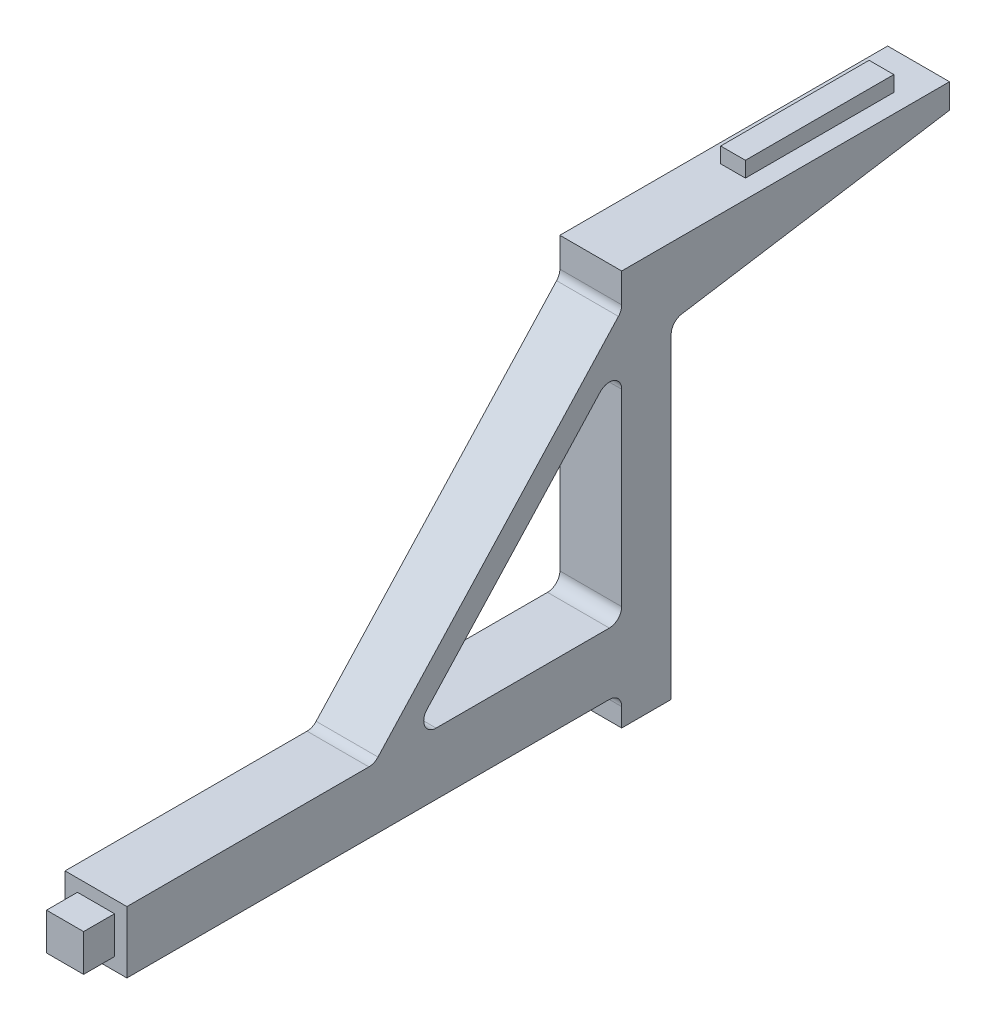
ISO-10303-21;
HEADER;
FILE_DESCRIPTION(('STEP AP214'),'2;1');
FILE_NAME('part.step','',(''),(''),'','','');
FILE_SCHEMA(('AUTOMOTIVE_DESIGN { 1 0 10303 214 1 1 1 1 }'));
ENDSEC;
DATA;
#1=APPLICATION_CONTEXT('core data for automotive mechanical design processes');
#2=APPLICATION_PROTOCOL_DEFINITION('international standard','automotive_design',2000,#1);
#3=PRODUCT_CONTEXT('',#1,'mechanical');
#4=PRODUCT('Part','Part','',(#3));
#5=PRODUCT_RELATED_PRODUCT_CATEGORY('part','',(#4));
#6=PRODUCT_DEFINITION_FORMATION('','',#4);
#7=PRODUCT_DEFINITION_CONTEXT('part definition',#1,'design');
#8=PRODUCT_DEFINITION('design','',#6,#7);
#9=PRODUCT_DEFINITION_SHAPE('','',#8);
#10=(LENGTH_UNIT() NAMED_UNIT(*) SI_UNIT(.MILLI.,.METRE.));
#11=(NAMED_UNIT(*) PLANE_ANGLE_UNIT() SI_UNIT($,.RADIAN.));
#12=(NAMED_UNIT(*) SI_UNIT($,.STERADIAN.) SOLID_ANGLE_UNIT());
#13=UNCERTAINTY_MEASURE_WITH_UNIT(LENGTH_MEASURE(1.E-05),#10,'distance_accuracy_value','');
#14=(GEOMETRIC_REPRESENTATION_CONTEXT(3) GLOBAL_UNCERTAINTY_ASSIGNED_CONTEXT((#13)) GLOBAL_UNIT_ASSIGNED_CONTEXT((#10,
#11,#12)) REPRESENTATION_CONTEXT('',''));
#15=CARTESIAN_POINT('',(0.,0.,0.));
#16=DIRECTION('',(0.,0.,1.));
#17=DIRECTION('',(1.,0.,0.));
#18=AXIS2_PLACEMENT_3D('',#15,#16,#17);
#19=CARTESIAN_POINT('',(-6.35,93.98,10.16));
#20=DIRECTION('',(0.,1.,0.));
#21=DIRECTION('',(0.,0.,1.));
#22=AXIS2_PLACEMENT_3D('',#19,#20,#21);
#23=PLANE('',#22);
#24=DIRECTION('',(0.,0.,-1.));
#25=VECTOR('',#24,1.);
#26=CARTESIAN_POINT('',(6.35,93.98,10.16));
#27=LINE('',#26,#25);
#28=CARTESIAN_POINT('',(6.35,93.98,10.16));
#29=VERTEX_POINT('',#28);
#30=CARTESIAN_POINT('',(6.35,93.98,-57.15));
#31=VERTEX_POINT('',#30);
#32=EDGE_CURVE('E604',#29,#31,#27,.T.);
#33=ORIENTED_EDGE('',*,*,#32,.T.);
#34=DIRECTION('',(-1.,0.,0.));
#35=VECTOR('',#34,1.);
#36=CARTESIAN_POINT('',(63.7253335502287,93.98,-57.15));
#37=LINE('',#36,#35);
#38=CARTESIAN_POINT('',(-6.35,93.98,-57.15));
#39=VERTEX_POINT('',#38);
#40=EDGE_CURVE('E479',#31,#39,#37,.T.);
#41=ORIENTED_EDGE('',*,*,#40,.T.);
#42=DIRECTION('',(0.,0.,-1.));
#43=VECTOR('',#42,1.);
#44=CARTESIAN_POINT('',(-6.35,93.98,10.16));
#45=LINE('',#44,#43);
#46=CARTESIAN_POINT('',(-6.35,93.98,10.16));
#47=VERTEX_POINT('',#46);
#48=EDGE_CURVE('E594',#47,#39,#45,.T.);
#49=ORIENTED_EDGE('',*,*,#48,.F.);
#50=DIRECTION('',(1.,0.,0.));
#51=VECTOR('',#50,1.);
#52=CARTESIAN_POINT('',(-6.35,93.98,10.16));
#53=LINE('',#52,#51);
#54=EDGE_CURVE('E589',#47,#29,#53,.T.);
#55=ORIENTED_EDGE('',*,*,#54,.T.);
#56=EDGE_LOOP('',(#33,#41,#49,#55));
#57=FACE_BOUND('',#56,.T.);
#58=DIRECTION('',(-1.,0.,0.));
#59=VECTOR('',#58,1.);
#60=CARTESIAN_POINT('',(-2.54,93.98,-49.53));
#61=LINE('',#60,#59);
#62=CARTESIAN_POINT('',(2.54,93.98,-49.53));
#63=VERTEX_POINT('',#62);
#64=CARTESIAN_POINT('',(-2.54,93.98,-49.53));
#65=VERTEX_POINT('',#64);
#66=EDGE_CURVE('E432',#63,#65,#61,.T.);
#67=ORIENTED_EDGE('',*,*,#66,.F.);
#68=DIRECTION('',(0.,0.,-1.));
#69=VECTOR('',#68,1.);
#70=CARTESIAN_POINT('',(2.54,93.98,-19.05));
#71=LINE('',#70,#69);
#72=CARTESIAN_POINT('',(2.54,93.98,-19.05));
#73=VERTEX_POINT('',#72);
#74=EDGE_CURVE('E408',#73,#63,#71,.T.);
#75=ORIENTED_EDGE('',*,*,#74,.F.);
#76=DIRECTION('',(1.,0.,0.));
#77=VECTOR('',#76,1.);
#78=CARTESIAN_POINT('',(-2.54,93.98,-19.05));
#79=LINE('',#78,#77);
#80=CARTESIAN_POINT('',(-2.54,93.98,-19.05));
#81=VERTEX_POINT('',#80);
#82=EDGE_CURVE('E419',#81,#73,#79,.T.);
#83=ORIENTED_EDGE('',*,*,#82,.F.);
#84=DIRECTION('',(0.,0.,1.));
#85=VECTOR('',#84,1.);
#86=CARTESIAN_POINT('',(-2.54,93.98,-19.05));
#87=LINE('',#86,#85);
#88=EDGE_CURVE('E435',#65,#81,#87,.T.);
#89=ORIENTED_EDGE('',*,*,#88,.F.);
#90=EDGE_LOOP('',(#67,#75,#83,#89));
#91=FACE_BOUND('',#90,.T.);
#92=ADVANCED_FACE('F147',(#57,#91),#23,.T.);
#93=CARTESIAN_POINT('',(0.,0.,0.));
#94=DIRECTION('',(0.,0.,1.));
#95=DIRECTION('',(1.,0.,0.));
#96=AXIS2_PLACEMENT_3D('',#93,#94,#95);
#97=PLANE('',#96);
#98=DIRECTION('',(0.,1.,0.));
#99=VECTOR('',#98,1.);
#100=CARTESIAN_POINT('',(-6.35,12.7,0.));
#101=LINE('',#100,#99);
#102=CARTESIAN_POINT('',(-6.35,12.7,0.));
#103=VERTEX_POINT('',#102);
#104=CARTESIAN_POINT('',(-6.35,77.6468841022824,0.));
#105=VERTEX_POINT('',#104);
#106=EDGE_CURVE('E598',#103,#105,#101,.T.);
#107=ORIENTED_EDGE('',*,*,#106,.T.);
#108=DIRECTION('',(1.,0.,0.));
#109=VECTOR('',#108,1.);
#110=CARTESIAN_POINT('',(0.,77.6468841022824,0.));
#111=LINE('',#110,#109);
#112=CARTESIAN_POINT('',(6.35,77.6468841022824,0.));
#113=VERTEX_POINT('',#112);
#114=EDGE_CURVE('E623',#105,#113,#111,.T.);
#115=ORIENTED_EDGE('',*,*,#114,.T.);
#116=DIRECTION('',(0.,1.,0.));
#117=VECTOR('',#116,1.);
#118=CARTESIAN_POINT('',(6.35,43.18,0.));
#119=LINE('',#118,#117);
#120=CARTESIAN_POINT('',(6.35,12.7,0.));
#121=VERTEX_POINT('',#120);
#122=EDGE_CURVE('E577',#121,#113,#119,.T.);
#123=ORIENTED_EDGE('',*,*,#122,.F.);
#124=DIRECTION('',(1.,0.,0.));
#125=VECTOR('',#124,1.);
#126=CARTESIAN_POINT('',(12.7,12.7,0.));
#127=LINE('',#126,#125);
#128=EDGE_CURVE('E458',#103,#121,#127,.T.);
#129=ORIENTED_EDGE('',*,*,#128,.F.);
#130=EDGE_LOOP('',(#107,#115,#123,#129));
#131=FACE_BOUND('',#130,.T.);
#132=ADVANCED_FACE('F800',(#131),#97,.F.);
#133=CARTESIAN_POINT('',(0.,0.,10.16));
#134=DIRECTION('',(0.,0.,1.));
#135=DIRECTION('',(1.,0.,0.));
#136=AXIS2_PLACEMENT_3D('',#133,#134,#135);
#137=PLANE('',#136);
#138=DIRECTION('',(0.,-1.,0.));
#139=VECTOR('',#138,1.);
#140=CARTESIAN_POINT('',(-6.35,12.7,10.16));
#141=LINE('',#140,#139);
#142=CARTESIAN_POINT('',(-6.35,87.9580548598883,10.16));
#143=VERTEX_POINT('',#142);
#144=EDGE_CURVE('E578',#47,#143,#141,.T.);
#145=ORIENTED_EDGE('',*,*,#144,.T.);
#146=DIRECTION('',(1.,0.,0.));
#147=VECTOR('',#146,1.);
#148=CARTESIAN_POINT('',(0.,87.9580548598883,10.16));
#149=LINE('',#148,#147);
#150=CARTESIAN_POINT('',(6.35,87.9580548598883,10.16));
#151=VERTEX_POINT('',#150);
#152=EDGE_CURVE('E630',#143,#151,#149,.T.);
#153=ORIENTED_EDGE('',*,*,#152,.T.);
#154=DIRECTION('',(0.,-1.,0.));
#155=VECTOR('',#154,1.);
#156=CARTESIAN_POINT('',(6.35,43.18,10.16));
#157=LINE('',#156,#155);
#158=EDGE_CURVE('E585',#29,#151,#157,.T.);
#159=ORIENTED_EDGE('',*,*,#158,.F.);
#160=ORIENTED_EDGE('',*,*,#54,.F.);
#161=EDGE_LOOP('',(#145,#153,#159,#160));
#162=FACE_BOUND('',#161,.T.);
#163=ADVANCED_FACE('F782',(#162),#137,.T.);
#164=CARTESIAN_POINT('',(-6.35,72.9519223768567,10.16));
#165=VERTEX_POINT('',#164);
#166=CARTESIAN_POINT('',(-6.35,34.29,10.16));
#167=VERTEX_POINT('',#166);
#168=EDGE_CURVE('E583',#165,#167,#141,.T.);
#169=ORIENTED_EDGE('',*,*,#168,.T.);
#170=DIRECTION('',(-1.,0.,0.));
#171=VECTOR('',#170,1.);
#172=CARTESIAN_POINT('',(0.,34.29,10.16));
#173=LINE('',#172,#171);
#174=CARTESIAN_POINT('',(6.35,34.29,10.16));
#175=VERTEX_POINT('',#174);
#176=EDGE_CURVE('E662',#167,#175,#173,.F.);
#177=ORIENTED_EDGE('',*,*,#176,.T.);
#178=CARTESIAN_POINT('',(6.35,72.9519223768567,10.16));
#179=VERTEX_POINT('',#178);
#180=EDGE_CURVE('E590',#179,#175,#157,.T.);
#181=ORIENTED_EDGE('',*,*,#180,.F.);
#182=DIRECTION('',(1.,0.,0.));
#183=VECTOR('',#182,1.);
#184=CARTESIAN_POINT('',(0.,72.9519223768567,10.16));
#185=LINE('',#184,#183);
#186=EDGE_CURVE('E659',#179,#165,#185,.F.);
#187=ORIENTED_EDGE('',*,*,#186,.T.);
#188=EDGE_LOOP('',(#169,#177,#181,#187));
#189=FACE_BOUND('',#188,.T.);
#190=ADVANCED_FACE('F706',(#189),#137,.T.);
#191=CARTESIAN_POINT('',(-6.35,31.75,111.76));
#192=DIRECTION('',(0.,-1.,0.));
#193=DIRECTION('',(0.,0.,-1.));
#194=AXIS2_PLACEMENT_3D('',#191,#192,#193);
#195=PLANE('',#194);
#196=DIRECTION('',(0.,0.,-1.));
#197=VECTOR('',#196,1.);
#198=CARTESIAN_POINT('',(6.35,31.75,111.76));
#199=LINE('',#198,#197);
#200=CARTESIAN_POINT('',(6.35,31.75,111.76));
#201=VERTEX_POINT('',#200);
#202=CARTESIAN_POINT('',(6.35,31.75,62.0746104710973));
#203=VERTEX_POINT('',#202);
#204=EDGE_CURVE('E573',#201,#203,#199,.T.);
#205=ORIENTED_EDGE('',*,*,#204,.T.);
#206=DIRECTION('',(1.,0.,0.));
#207=VECTOR('',#206,1.);
#208=CARTESIAN_POINT('',(-6.35000000000002,31.75,62.0746104710973));
#209=LINE('',#208,#207);
#210=CARTESIAN_POINT('',(-6.35,31.75,62.0746104710973));
#211=VERTEX_POINT('',#210);
#212=EDGE_CURVE('E611',#203,#211,#209,.F.);
#213=ORIENTED_EDGE('',*,*,#212,.T.);
#214=DIRECTION('',(0.,0.,-1.));
#215=VECTOR('',#214,1.);
#216=CARTESIAN_POINT('',(-6.35,31.75,111.76));
#217=LINE('',#216,#215);
#218=CARTESIAN_POINT('',(-6.35,31.75,111.76));
#219=VERTEX_POINT('',#218);
#220=EDGE_CURVE('E568',#219,#211,#217,.T.);
#221=ORIENTED_EDGE('',*,*,#220,.F.);
#222=DIRECTION('',(-1.,0.,0.));
#223=VECTOR('',#222,1.);
#224=CARTESIAN_POINT('',(-6.35,31.75,111.76));
#225=LINE('',#224,#223);
#226=EDGE_CURVE('E550',#201,#219,#225,.T.);
#227=ORIENTED_EDGE('',*,*,#226,.F.);
#228=EDGE_LOOP('',(#205,#213,#221,#227));
#229=FACE_BOUND('',#228,.T.);
#230=ADVANCED_FACE('F1030',(#229),#195,.F.);
#231=CARTESIAN_POINT('',(-6.35,31.75,48.2689685867081));
#232=VERTEX_POINT('',#231);
#233=CARTESIAN_POINT('',(-6.35,31.75,12.7));
#234=VERTEX_POINT('',#233);
#235=EDGE_CURVE('E567',#232,#234,#217,.T.);
#236=ORIENTED_EDGE('',*,*,#235,.F.);
#237=DIRECTION('',(1.,0.,0.));
#238=VECTOR('',#237,1.);
#239=CARTESIAN_POINT('',(6.35,31.75,48.2689685867081));
#240=LINE('',#239,#238);
#241=CARTESIAN_POINT('',(6.35,31.75,48.2689685867081));
#242=VERTEX_POINT('',#241);
#243=EDGE_CURVE('E648',#232,#242,#240,.T.);
#244=ORIENTED_EDGE('',*,*,#243,.T.);
#245=CARTESIAN_POINT('',(6.35,31.75,12.7));
#246=VERTEX_POINT('',#245);
#247=EDGE_CURVE('E572',#242,#246,#199,.T.);
#248=ORIENTED_EDGE('',*,*,#247,.T.);
#249=DIRECTION('',(-1.,0.,0.));
#250=VECTOR('',#249,1.);
#251=CARTESIAN_POINT('',(-6.35,31.75,12.7));
#252=LINE('',#251,#250);
#253=EDGE_CURVE('E644',#246,#234,#252,.T.);
#254=ORIENTED_EDGE('',*,*,#253,.T.);
#255=EDGE_LOOP('',(#236,#244,#248,#254));
#256=FACE_BOUND('',#255,.T.);
#257=ADVANCED_FACE('F724',(#256),#195,.F.);
#258=CARTESIAN_POINT('',(0.,0.,111.76));
#259=DIRECTION('',(0.,0.,-1.));
#260=DIRECTION('',(-1.,0.,0.));
#261=AXIS2_PLACEMENT_3D('',#258,#259,#260);
#262=PLANE('',#261);
#263=DIRECTION('',(0.,1.,0.));
#264=VECTOR('',#263,1.);
#265=CARTESIAN_POINT('',(6.35,19.05,111.76));
#266=LINE('',#265,#264);
#267=CARTESIAN_POINT('',(6.35,19.05,111.76));
#268=VERTEX_POINT('',#267);
#269=EDGE_CURVE('E546',#268,#201,#266,.T.);
#270=ORIENTED_EDGE('',*,*,#269,.T.);
#271=ORIENTED_EDGE('',*,*,#226,.T.);
#272=DIRECTION('',(0.,-1.,0.));
#273=VECTOR('',#272,1.);
#274=CARTESIAN_POINT('',(-6.35,19.05,111.76));
#275=LINE('',#274,#273);
#276=CARTESIAN_POINT('',(-6.35,19.05,111.76));
#277=VERTEX_POINT('',#276);
#278=EDGE_CURVE('E553',#219,#277,#275,.T.);
#279=ORIENTED_EDGE('',*,*,#278,.T.);
#280=DIRECTION('',(1.,0.,0.));
#281=VECTOR('',#280,1.);
#282=CARTESIAN_POINT('',(-6.35,19.05,111.76));
#283=LINE('',#282,#281);
#284=EDGE_CURVE('E556',#277,#268,#283,.T.);
#285=ORIENTED_EDGE('',*,*,#284,.T.);
#286=EDGE_LOOP('',(#270,#271,#279,#285));
#287=FACE_BOUND('',#286,.T.);
#288=DIRECTION('',(0.,1.,0.));
#289=VECTOR('',#288,1.);
#290=CARTESIAN_POINT('',(3.81,21.59,111.76));
#291=LINE('',#290,#289);
#292=CARTESIAN_POINT('',(3.81,21.59,111.76));
#293=VERTEX_POINT('',#292);
#294=CARTESIAN_POINT('',(3.81,29.21,111.76));
#295=VERTEX_POINT('',#294);
#296=EDGE_CURVE('E498',#293,#295,#291,.T.);
#297=ORIENTED_EDGE('',*,*,#296,.F.);
#298=DIRECTION('',(1.,0.,0.));
#299=VECTOR('',#298,1.);
#300=CARTESIAN_POINT('',(-3.81,21.59,111.76));
#301=LINE('',#300,#299);
#302=CARTESIAN_POINT('',(-3.81,21.59,111.76));
#303=VERTEX_POINT('',#302);
#304=EDGE_CURVE('E507',#303,#293,#301,.T.);
#305=ORIENTED_EDGE('',*,*,#304,.F.);
#306=DIRECTION('',(0.,-1.,0.));
#307=VECTOR('',#306,1.);
#308=CARTESIAN_POINT('',(-3.81,21.59,111.76));
#309=LINE('',#308,#307);
#310=CARTESIAN_POINT('',(-3.81,29.21,111.76));
#311=VERTEX_POINT('',#310);
#312=EDGE_CURVE('E524',#311,#303,#309,.T.);
#313=ORIENTED_EDGE('',*,*,#312,.F.);
#314=DIRECTION('',(-1.,0.,0.));
#315=VECTOR('',#314,1.);
#316=CARTESIAN_POINT('',(-3.81,29.21,111.76));
#317=LINE('',#316,#315);
#318=EDGE_CURVE('E520',#295,#311,#317,.T.);
#319=ORIENTED_EDGE('',*,*,#318,.F.);
#320=EDGE_LOOP('',(#297,#305,#313,#319));
#321=FACE_BOUND('',#320,.T.);
#322=ADVANCED_FACE('F761',(#287,#321),#262,.F.);
#323=CARTESIAN_POINT('',(6.35,16.51,10.16));
#324=VERTEX_POINT('',#323);
#325=CARTESIAN_POINT('',(6.35,12.7,10.16));
#326=VERTEX_POINT('',#325);
#327=EDGE_CURVE('E582',#324,#326,#157,.T.);
#328=ORIENTED_EDGE('',*,*,#327,.F.);
#329=DIRECTION('',(1.,0.,0.));
#330=VECTOR('',#329,1.);
#331=CARTESIAN_POINT('',(0.,16.51,10.16));
#332=LINE('',#331,#330);
#333=CARTESIAN_POINT('',(-6.35,16.51,10.16));
#334=VERTEX_POINT('',#333);
#335=EDGE_CURVE('E641',#324,#334,#332,.F.);
#336=ORIENTED_EDGE('',*,*,#335,.T.);
#337=CARTESIAN_POINT('',(-6.35,12.7,10.16));
#338=VERTEX_POINT('',#337);
#339=EDGE_CURVE('E584',#334,#338,#141,.T.);
#340=ORIENTED_EDGE('',*,*,#339,.T.);
#341=DIRECTION('',(-1.,0.,0.));
#342=VECTOR('',#341,1.);
#343=CARTESIAN_POINT('',(0.,12.7,10.16));
#344=LINE('',#343,#342);
#345=EDGE_CURVE('E461',#326,#338,#344,.T.);
#346=ORIENTED_EDGE('',*,*,#345,.F.);
#347=EDGE_LOOP('',(#328,#336,#340,#346));
#348=FACE_BOUND('',#347,.T.);
#349=ADVANCED_FACE('F744',(#348),#137,.T.);
#350=CARTESIAN_POINT('',(6.35,43.18,10.16));
#351=DIRECTION('',(-1.,0.,0.));
#352=DIRECTION('',(0.,0.,1.));
#353=AXIS2_PLACEMENT_3D('',#350,#351,#352);
#354=PLANE('',#353);
#355=ORIENTED_EDGE('',*,*,#122,.T.);
#356=CARTESIAN_POINT('',(6.35,77.6468841022824,-2.54));
#357=DIRECTION('',(-1.,0.,0.));
#358=DIRECTION('',(0.,0.,1.));
#359=AXIS2_PLACEMENT_3D('',#356,#357,#358);
#360=CIRCLE('',#359,2.54);
#361=CARTESIAN_POINT('',(6.35,80.1553860455461,-2.14122938844176));
#362=VERTEX_POINT('',#361);
#363=EDGE_CURVE('E665',#113,#362,#360,.T.);
#364=ORIENTED_EDGE('',*,*,#363,.T.);
#365=DIRECTION('',(0.,0.156996303763087,-0.987599190261276));
#366=VECTOR('',#365,1.);
#367=CARTESIAN_POINT('',(6.35,79.814999882,0.));
#368=LINE('',#367,#366);
#369=CARTESIAN_POINT('',(6.35,88.9,-57.15));
#370=VERTEX_POINT('',#369);
#371=EDGE_CURVE('E452',#362,#370,#368,.T.);
#372=ORIENTED_EDGE('',*,*,#371,.T.);
#373=DIRECTION('',(0.,1.,0.));
#374=VECTOR('',#373,1.);
#375=CARTESIAN_POINT('',(6.35,12.6999999999999,-57.1499999999999));
#376=LINE('',#375,#374);
#377=EDGE_CURVE('E470',#370,#31,#376,.T.);
#378=ORIENTED_EDGE('',*,*,#377,.T.);
#379=ORIENTED_EDGE('',*,*,#32,.F.);
#380=ORIENTED_EDGE('',*,*,#158,.T.);
#381=CARTESIAN_POINT('',(6.35,87.9580548598883,12.7));
#382=DIRECTION('',(-1.,0.,0.));
#383=DIRECTION('',(0.,0.,1.));
#384=AXIS2_PLACEMENT_3D('',#381,#382,#383);
#385=CIRCLE('',#384,2.54);
#386=CARTESIAN_POINT('',(6.35,86.2383312716033,10.830735230125));
#387=VERTEX_POINT('',#386);
#388=EDGE_CURVE('E671',#151,#387,#385,.T.);
#389=ORIENTED_EDGE('',*,*,#388,.T.);
#390=DIRECTION('',(0.,0.73593101176183,-0.677056530820883));
#391=VECTOR('',#390,1.);
#392=CARTESIAN_POINT('',(6.35,63.2523830155979,31.9778076256499));
#393=LINE('',#392,#391);
#394=CARTESIAN_POINT('',(6.35,32.5702764117149,60.2053457012222));
#395=VERTEX_POINT('',#394);
#396=EDGE_CURVE('E474',#395,#387,#393,.T.);
#397=ORIENTED_EDGE('',*,*,#396,.F.);
#398=CARTESIAN_POINT('',(6.34999999999999,34.29,62.0746104710973));
#399=DIRECTION('',(-1.,0.,0.));
#400=DIRECTION('',(0.,0.,1.));
#401=AXIS2_PLACEMENT_3D('',#398,#399,#400);
#402=CIRCLE('',#401,2.54);
#403=EDGE_CURVE('E614',#395,#203,#402,.T.);
#404=ORIENTED_EDGE('',*,*,#403,.T.);
#405=ORIENTED_EDGE('',*,*,#204,.F.);
#406=ORIENTED_EDGE('',*,*,#269,.F.);
#407=DIRECTION('',(0.,0.,-1.));
#408=VECTOR('',#407,1.);
#409=CARTESIAN_POINT('',(6.35,19.05,111.76));
#410=LINE('',#409,#408);
#411=CARTESIAN_POINT('',(6.35,19.05,12.7));
#412=VERTEX_POINT('',#411);
#413=EDGE_CURVE('E559',#268,#412,#410,.T.);
#414=ORIENTED_EDGE('',*,*,#413,.T.);
#415=CARTESIAN_POINT('',(6.35,16.51,12.7));
#416=DIRECTION('',(-1.,0.,0.));
#417=DIRECTION('',(0.,0.,1.));
#418=AXIS2_PLACEMENT_3D('',#415,#416,#417);
#419=CIRCLE('',#418,2.54);
#420=EDGE_CURVE('E677',#412,#324,#419,.T.);
#421=ORIENTED_EDGE('',*,*,#420,.T.);
#422=ORIENTED_EDGE('',*,*,#327,.T.);
#423=DIRECTION('',(0.,0.,-1.));
#424=VECTOR('',#423,1.);
#425=CARTESIAN_POINT('',(6.35,12.7,10.16));
#426=LINE('',#425,#424);
#427=EDGE_CURVE('E465',#326,#121,#426,.T.);
#428=ORIENTED_EDGE('',*,*,#427,.T.);
#429=EDGE_LOOP('',(#355,#364,#372,#378,#379,#380,#389,#397,#404,#405,#406,#414,#421,#422,#428));
#430=FACE_BOUND('',#429,.T.);
#431=DIRECTION('',(0.,-0.73593101176183,0.677056530820883));
#432=VECTOR('',#431,1.);
#433=CARTESIAN_POINT('',(6.35,59.8129358390278,28.2392780858998));
#434=LINE('',#433,#432);
#435=CARTESIAN_POINT('',(6.35,74.6716459651417,14.569264769875));
#436=VERTEX_POINT('',#435);
#437=CARTESIAN_POINT('',(6.35,36.009723588285,50.1382333565832));
#438=VERTEX_POINT('',#437);
#439=EDGE_CURVE('E486',#436,#438,#434,.T.);
#440=ORIENTED_EDGE('',*,*,#439,.F.);
#441=CARTESIAN_POINT('',(6.34999999999999,72.9519223768567,12.7));
#442=DIRECTION('',(-1.,0.,0.));
#443=DIRECTION('',(0.,0.,1.));
#444=AXIS2_PLACEMENT_3D('',#441,#442,#443);
#445=CIRCLE('',#444,2.54);
#446=EDGE_CURVE('E156',#436,#179,#445,.T.);
#447=ORIENTED_EDGE('',*,*,#446,.T.);
#448=ORIENTED_EDGE('',*,*,#180,.T.);
#449=CARTESIAN_POINT('',(6.35,34.29,12.7));
#450=DIRECTION('',(-1.,0.,0.));
#451=DIRECTION('',(0.,0.,1.));
#452=AXIS2_PLACEMENT_3D('',#449,#450,#451);
#453=CIRCLE('',#452,2.54);
#454=EDGE_CURVE('E692',#175,#246,#453,.T.);
#455=ORIENTED_EDGE('',*,*,#454,.T.);
#456=ORIENTED_EDGE('',*,*,#247,.F.);
#457=CARTESIAN_POINT('',(6.35,34.29,48.2689685867081));
#458=DIRECTION('',(-1.,0.,0.));
#459=DIRECTION('',(0.,0.,1.));
#460=AXIS2_PLACEMENT_3D('',#457,#458,#459);
#461=CIRCLE('',#460,2.54);
#462=EDGE_CURVE('E683',#242,#438,#461,.T.);
#463=ORIENTED_EDGE('',*,*,#462,.T.);
#464=EDGE_LOOP('',(#440,#447,#448,#455,#456,#463));
#465=FACE_BOUND('',#464,.T.);
#466=ADVANCED_FACE('F699',(#430,#465),#354,.F.);
#467=CARTESIAN_POINT('',(-6.35,12.7,10.16));
#468=DIRECTION('',(-1.,0.,0.));
#469=DIRECTION('',(0.,0.,1.));
#470=AXIS2_PLACEMENT_3D('',#467,#468,#469);
#471=PLANE('',#470);
#472=DIRECTION('',(0.,0.156996303763087,-0.987599190261276));
#473=VECTOR('',#472,1.);
#474=CARTESIAN_POINT('',(-6.35,79.814999882,0.));
#475=LINE('',#474,#473);
#476=CARTESIAN_POINT('',(-6.35,80.1553860455461,-2.14122938844176));
#477=VERTEX_POINT('',#476);
#478=CARTESIAN_POINT('',(-6.35,88.9,-57.15));
#479=VERTEX_POINT('',#478);
#480=EDGE_CURVE('E455',#477,#479,#475,.T.);
#481=ORIENTED_EDGE('',*,*,#480,.F.);
#482=CARTESIAN_POINT('',(-6.35,77.6468841022824,-2.54));
#483=DIRECTION('',(-1.,0.,0.));
#484=DIRECTION('',(0.,0.,1.));
#485=AXIS2_PLACEMENT_3D('',#482,#483,#484);
#486=CIRCLE('',#485,2.54);
#487=EDGE_CURVE('E668',#477,#105,#486,.F.);
#488=ORIENTED_EDGE('',*,*,#487,.T.);
#489=ORIENTED_EDGE('',*,*,#106,.F.);
#490=DIRECTION('',(0.,0.,-1.));
#491=VECTOR('',#490,1.);
#492=CARTESIAN_POINT('',(-6.35,12.7,10.16));
#493=LINE('',#492,#491);
#494=EDGE_CURVE('E620',#338,#103,#493,.T.);
#495=ORIENTED_EDGE('',*,*,#494,.F.);
#496=ORIENTED_EDGE('',*,*,#339,.F.);
#497=CARTESIAN_POINT('',(-6.35,16.51,12.7));
#498=DIRECTION('',(-1.,0.,0.));
#499=DIRECTION('',(0.,0.,1.));
#500=AXIS2_PLACEMENT_3D('',#497,#498,#499);
#501=CIRCLE('',#500,2.54);
#502=CARTESIAN_POINT('',(-6.35,19.05,12.7));
#503=VERTEX_POINT('',#502);
#504=EDGE_CURVE('E680',#334,#503,#501,.F.);
#505=ORIENTED_EDGE('',*,*,#504,.T.);
#506=DIRECTION('',(0.,0.,-1.));
#507=VECTOR('',#506,1.);
#508=CARTESIAN_POINT('',(-6.35,19.05,111.76));
#509=LINE('',#508,#507);
#510=EDGE_CURVE('E563',#277,#503,#509,.T.);
#511=ORIENTED_EDGE('',*,*,#510,.F.);
#512=ORIENTED_EDGE('',*,*,#278,.F.);
#513=ORIENTED_EDGE('',*,*,#220,.T.);
#514=CARTESIAN_POINT('',(-6.34999999999999,34.29,62.0746104710973));
#515=DIRECTION('',(-1.,0.,0.));
#516=DIRECTION('',(0.,0.,1.));
#517=AXIS2_PLACEMENT_3D('',#514,#515,#516);
#518=CIRCLE('',#517,2.54);
#519=CARTESIAN_POINT('',(-6.34999999999999,32.5702764117149,60.2053457012222));
#520=VERTEX_POINT('',#519);
#521=EDGE_CURVE('E617',#211,#520,#518,.F.);
#522=ORIENTED_EDGE('',*,*,#521,.T.);
#523=DIRECTION('',(0.,0.73593101176183,-0.677056530820883));
#524=VECTOR('',#523,1.);
#525=CARTESIAN_POINT('',(-6.34999999999999,63.2523830155979,31.9778076256499));
#526=LINE('',#525,#524);
#527=CARTESIAN_POINT('',(-6.34999999999999,86.2383312716033,10.830735230125));
#528=VERTEX_POINT('',#527);
#529=EDGE_CURVE('E490',#520,#528,#526,.T.);
#530=ORIENTED_EDGE('',*,*,#529,.T.);
#531=CARTESIAN_POINT('',(-6.35,87.9580548598883,12.7));
#532=DIRECTION('',(-1.,0.,0.));
#533=DIRECTION('',(0.,0.,1.));
#534=AXIS2_PLACEMENT_3D('',#531,#532,#533);
#535=CIRCLE('',#534,2.54);
#536=EDGE_CURVE('E674',#528,#143,#535,.F.);
#537=ORIENTED_EDGE('',*,*,#536,.T.);
#538=ORIENTED_EDGE('',*,*,#144,.F.);
#539=ORIENTED_EDGE('',*,*,#48,.T.);
#540=DIRECTION('',(0.,-1.,0.));
#541=VECTOR('',#540,1.);
#542=CARTESIAN_POINT('',(-6.35,12.6999999999999,-57.1499999999999));
#543=LINE('',#542,#541);
#544=EDGE_CURVE('E469',#39,#479,#543,.T.);
#545=ORIENTED_EDGE('',*,*,#544,.T.);
#546=EDGE_LOOP('',(#481,#488,#489,#495,#496,#505,#511,#512,#513,#522,#530,#537,#538,#539,#545));
#547=FACE_BOUND('',#546,.T.);
#548=ORIENTED_EDGE('',*,*,#168,.F.);
#549=CARTESIAN_POINT('',(-6.34999999999999,72.9519223768567,12.7));
#550=DIRECTION('',(-1.,0.,0.));
#551=DIRECTION('',(0.,0.,1.));
#552=AXIS2_PLACEMENT_3D('',#549,#550,#551);
#553=CIRCLE('',#552,2.54);
#554=CARTESIAN_POINT('',(-6.34999999999999,74.6716459651417,14.5692647698751));
#555=VERTEX_POINT('',#554);
#556=EDGE_CURVE('E12',#165,#555,#553,.F.);
#557=ORIENTED_EDGE('',*,*,#556,.T.);
#558=DIRECTION('',(0.,-0.73593101176183,0.677056530820883));
#559=VECTOR('',#558,1.);
#560=CARTESIAN_POINT('',(-6.34999999999999,59.8129358390278,28.2392780858998));
#561=LINE('',#560,#559);
#562=CARTESIAN_POINT('',(-6.34999999999999,36.009723588285,50.1382333565832));
#563=VERTEX_POINT('',#562);
#564=EDGE_CURVE('E494',#555,#563,#561,.T.);
#565=ORIENTED_EDGE('',*,*,#564,.T.);
#566=CARTESIAN_POINT('',(-6.35,34.29,48.2689685867081));
#567=DIRECTION('',(-1.,0.,0.));
#568=DIRECTION('',(0.,0.,1.));
#569=AXIS2_PLACEMENT_3D('',#566,#567,#568);
#570=CIRCLE('',#569,2.54);
#571=EDGE_CURVE('E686',#563,#232,#570,.F.);
#572=ORIENTED_EDGE('',*,*,#571,.T.);
#573=ORIENTED_EDGE('',*,*,#235,.T.);
#574=CARTESIAN_POINT('',(-6.35,34.29,12.7));
#575=DIRECTION('',(-1.,0.,0.));
#576=DIRECTION('',(0.,0.,1.));
#577=AXIS2_PLACEMENT_3D('',#574,#575,#576);
#578=CIRCLE('',#577,2.54);
#579=EDGE_CURVE('E689',#234,#167,#578,.F.);
#580=ORIENTED_EDGE('',*,*,#579,.T.);
#581=EDGE_LOOP('',(#548,#557,#565,#572,#573,#580));
#582=FACE_BOUND('',#581,.T.);
#583=ADVANCED_FACE('F713',(#547,#582),#471,.T.);
#584=CARTESIAN_POINT('',(-6.35,19.05,111.76));
#585=DIRECTION('',(0.,1.,0.));
#586=DIRECTION('',(0.,0.,1.));
#587=AXIS2_PLACEMENT_3D('',#584,#585,#586);
#588=PLANE('',#587);
#589=ORIENTED_EDGE('',*,*,#510,.T.);
#590=DIRECTION('',(1.,0.,0.));
#591=VECTOR('',#590,1.);
#592=CARTESIAN_POINT('',(-6.35,19.05,12.7));
#593=LINE('',#592,#591);
#594=EDGE_CURVE('E637',#503,#412,#593,.T.);
#595=ORIENTED_EDGE('',*,*,#594,.T.);
#596=ORIENTED_EDGE('',*,*,#413,.F.);
#597=ORIENTED_EDGE('',*,*,#284,.F.);
#598=EDGE_LOOP('',(#589,#595,#596,#597));
#599=FACE_BOUND('',#598,.T.);
#600=ADVANCED_FACE('F756',(#599),#588,.F.);
#601=CARTESIAN_POINT('',(3.81,21.59,118.11));
#602=DIRECTION('',(-1.,0.,0.));
#603=DIRECTION('',(0.,0.,1.));
#604=AXIS2_PLACEMENT_3D('',#601,#602,#603);
#605=PLANE('',#604);
#606=ORIENTED_EDGE('',*,*,#296,.T.);
#607=DIRECTION('',(0.,0.,-1.));
#608=VECTOR('',#607,1.);
#609=CARTESIAN_POINT('',(3.81,29.21,118.11));
#610=LINE('',#609,#608);
#611=CARTESIAN_POINT('',(3.81,29.21,118.11));
#612=VERTEX_POINT('',#611);
#613=EDGE_CURVE('E542',#612,#295,#610,.T.);
#614=ORIENTED_EDGE('',*,*,#613,.F.);
#615=DIRECTION('',(0.,1.,0.));
#616=VECTOR('',#615,1.);
#617=CARTESIAN_POINT('',(3.81,21.59,118.11));
#618=LINE('',#617,#616);
#619=CARTESIAN_POINT('',(3.81,21.59,118.11));
#620=VERTEX_POINT('',#619);
#621=EDGE_CURVE('E502',#620,#612,#618,.T.);
#622=ORIENTED_EDGE('',*,*,#621,.F.);
#623=DIRECTION('',(0.,0.,-1.));
#624=VECTOR('',#623,1.);
#625=CARTESIAN_POINT('',(3.81,21.59,118.11));
#626=LINE('',#625,#624);
#627=EDGE_CURVE('E516',#620,#293,#626,.T.);
#628=ORIENTED_EDGE('',*,*,#627,.T.);
#629=EDGE_LOOP('',(#606,#614,#622,#628));
#630=FACE_BOUND('',#629,.T.);
#631=ADVANCED_FACE('F1086',(#630),#605,.F.);
#632=CARTESIAN_POINT('',(-3.81,29.21,118.11));
#633=DIRECTION('',(0.,-1.,0.));
#634=DIRECTION('',(0.,0.,-1.));
#635=AXIS2_PLACEMENT_3D('',#632,#633,#634);
#636=PLANE('',#635);
#637=ORIENTED_EDGE('',*,*,#318,.T.);
#638=DIRECTION('',(0.,0.,-1.));
#639=VECTOR('',#638,1.);
#640=CARTESIAN_POINT('',(-3.81,29.21,118.11));
#641=LINE('',#640,#639);
#642=CARTESIAN_POINT('',(-3.81,29.21,118.11));
#643=VERTEX_POINT('',#642);
#644=EDGE_CURVE('E538',#643,#311,#641,.T.);
#645=ORIENTED_EDGE('',*,*,#644,.F.);
#646=DIRECTION('',(-1.,0.,0.));
#647=VECTOR('',#646,1.);
#648=CARTESIAN_POINT('',(-3.81,29.21,118.11));
#649=LINE('',#648,#647);
#650=EDGE_CURVE('E506',#612,#643,#649,.T.);
#651=ORIENTED_EDGE('',*,*,#650,.F.);
#652=ORIENTED_EDGE('',*,*,#613,.T.);
#653=EDGE_LOOP('',(#637,#645,#651,#652));
#654=FACE_BOUND('',#653,.T.);
#655=ADVANCED_FACE('F1076',(#654),#636,.F.);
#656=CARTESIAN_POINT('',(-3.81,21.59,118.11));
#657=DIRECTION('',(1.,0.,0.));
#658=DIRECTION('',(0.,0.,-1.));
#659=AXIS2_PLACEMENT_3D('',#656,#657,#658);
#660=PLANE('',#659);
#661=ORIENTED_EDGE('',*,*,#312,.T.);
#662=DIRECTION('',(0.,0.,-1.));
#663=VECTOR('',#662,1.);
#664=CARTESIAN_POINT('',(-3.81,21.59,118.11));
#665=LINE('',#664,#663);
#666=CARTESIAN_POINT('',(-3.81,21.59,118.11));
#667=VERTEX_POINT('',#666);
#668=EDGE_CURVE('E534',#667,#303,#665,.T.);
#669=ORIENTED_EDGE('',*,*,#668,.F.);
#670=DIRECTION('',(0.,-1.,0.));
#671=VECTOR('',#670,1.);
#672=CARTESIAN_POINT('',(-3.81,21.59,118.11));
#673=LINE('',#672,#671);
#674=EDGE_CURVE('E510',#643,#667,#673,.T.);
#675=ORIENTED_EDGE('',*,*,#674,.F.);
#676=ORIENTED_EDGE('',*,*,#644,.T.);
#677=EDGE_LOOP('',(#661,#669,#675,#676));
#678=FACE_BOUND('',#677,.T.);
#679=ADVANCED_FACE('F1066',(#678),#660,.F.);
#680=CARTESIAN_POINT('',(-3.81,21.59,118.11));
#681=DIRECTION('',(0.,1.,0.));
#682=DIRECTION('',(0.,0.,1.));
#683=AXIS2_PLACEMENT_3D('',#680,#681,#682);
#684=PLANE('',#683);
#685=ORIENTED_EDGE('',*,*,#304,.T.);
#686=ORIENTED_EDGE('',*,*,#627,.F.);
#687=DIRECTION('',(1.,0.,0.));
#688=VECTOR('',#687,1.);
#689=CARTESIAN_POINT('',(-3.81,21.59,118.11));
#690=LINE('',#689,#688);
#691=EDGE_CURVE('E513',#667,#620,#690,.T.);
#692=ORIENTED_EDGE('',*,*,#691,.F.);
#693=ORIENTED_EDGE('',*,*,#668,.T.);
#694=EDGE_LOOP('',(#685,#686,#692,#693));
#695=FACE_BOUND('',#694,.T.);
#696=ADVANCED_FACE('F1057',(#695),#684,.F.);
#697=CARTESIAN_POINT('',(0.,0.,118.11));
#698=DIRECTION('',(0.,0.,-1.));
#699=DIRECTION('',(-1.,0.,0.));
#700=AXIS2_PLACEMENT_3D('',#697,#698,#699);
#701=PLANE('',#700);
#702=ORIENTED_EDGE('',*,*,#621,.T.);
#703=ORIENTED_EDGE('',*,*,#650,.T.);
#704=ORIENTED_EDGE('',*,*,#674,.T.);
#705=ORIENTED_EDGE('',*,*,#691,.T.);
#706=EDGE_LOOP('',(#702,#703,#704,#705));
#707=FACE_BOUND('',#706,.T.);
#708=ADVANCED_FACE('F1011',(#707),#701,.F.);
#709=CARTESIAN_POINT('',(-81.3806624151584,63.2523830155979,31.9778076256499));
#710=DIRECTION('',(0.,-0.677056530820883,-0.73593101176183));
#711=DIRECTION('',(0.,0.73593101176183,-0.677056530820883));
#712=AXIS2_PLACEMENT_3D('',#709,#710,#711);
#713=PLANE('',#712);
#714=ORIENTED_EDGE('',*,*,#396,.T.);
#715=DIRECTION('',(1.,0.,0.));
#716=VECTOR('',#715,1.);
#717=CARTESIAN_POINT('',(-81.3806624151584,86.2383312716033,10.830735230125));
#718=LINE('',#717,#716);
#719=EDGE_CURVE('E634',#387,#528,#718,.F.);
#720=ORIENTED_EDGE('',*,*,#719,.T.);
#721=ORIENTED_EDGE('',*,*,#529,.F.);
#722=DIRECTION('',(1.,0.,0.));
#723=VECTOR('',#722,1.);
#724=CARTESIAN_POINT('',(6.34999999999997,32.570276411715,60.2053457012222));
#725=LINE('',#724,#723);
#726=EDGE_CURVE('E607',#520,#395,#725,.T.);
#727=ORIENTED_EDGE('',*,*,#726,.T.);
#728=EDGE_LOOP('',(#714,#720,#721,#727));
#729=FACE_BOUND('',#728,.T.);
#730=ADVANCED_FACE('F774',(#729),#713,.F.);
#731=CARTESIAN_POINT('',(-81.3806624151584,59.8129358390278,28.2392780858998));
#732=DIRECTION('',(0.,0.677056530820883,0.73593101176183));
#733=DIRECTION('',(0.,-0.73593101176183,0.677056530820883));
#734=AXIS2_PLACEMENT_3D('',#731,#732,#733);
#735=PLANE('',#734);
#736=ORIENTED_EDGE('',*,*,#439,.T.);
#737=DIRECTION('',(1.,0.,0.));
#738=VECTOR('',#737,1.);
#739=CARTESIAN_POINT('',(-6.35,36.009723588285,50.1382333565832));
#740=LINE('',#739,#738);
#741=EDGE_CURVE('E656',#438,#563,#740,.F.);
#742=ORIENTED_EDGE('',*,*,#741,.T.);
#743=ORIENTED_EDGE('',*,*,#564,.F.);
#744=DIRECTION('',(1.,0.,0.));
#745=VECTOR('',#744,1.);
#746=CARTESIAN_POINT('',(-81.3806624151584,74.6716459651417,14.5692647698751));
#747=LINE('',#746,#745);
#748=EDGE_CURVE('E652',#555,#436,#747,.T.);
#749=ORIENTED_EDGE('',*,*,#748,.T.);
#750=EDGE_LOOP('',(#736,#742,#743,#749));
#751=FACE_BOUND('',#750,.T.);
#752=ADVANCED_FACE('F716',(#751),#735,.F.);
#753=CARTESIAN_POINT('',(-81.3806624151584,34.29,62.0746104710973));
#754=DIRECTION('',(-1.,0.,0.));
#755=DIRECTION('',(0.,0.,1.));
#756=AXIS2_PLACEMENT_3D('',#753,#754,#755);
#757=CYLINDRICAL_SURFACE('',#756,2.54);
#758=ORIENTED_EDGE('',*,*,#521,.F.);
#759=ORIENTED_EDGE('',*,*,#212,.F.);
#760=ORIENTED_EDGE('',*,*,#403,.F.);
#761=ORIENTED_EDGE('',*,*,#726,.F.);
#762=EDGE_LOOP('',(#758,#759,#760,#761));
#763=FACE_BOUND('',#762,.T.);
#764=ADVANCED_FACE('F771',(#763),#757,.F.);
#765=CARTESIAN_POINT('',(63.7253335502287,12.6999999999999,-57.1499999999999));
#766=DIRECTION('',(0.,0.,-1.));
#767=DIRECTION('',(0.,1.,0.));
#768=AXIS2_PLACEMENT_3D('',#765,#766,#767);
#769=PLANE('',#768);
#770=ORIENTED_EDGE('',*,*,#377,.F.);
#771=DIRECTION('',(-1.,0.,0.));
#772=VECTOR('',#771,1.);
#773=CARTESIAN_POINT('',(63.7253335502287,88.9,-57.15));
#774=LINE('',#773,#772);
#775=EDGE_CURVE('E475',#370,#479,#774,.T.);
#776=ORIENTED_EDGE('',*,*,#775,.T.);
#777=ORIENTED_EDGE('',*,*,#544,.F.);
#778=ORIENTED_EDGE('',*,*,#40,.F.);
#779=EDGE_LOOP('',(#770,#776,#777,#778));
#780=FACE_BOUND('',#779,.T.);
#781=ADVANCED_FACE('F791',(#780),#769,.T.);
#782=CARTESIAN_POINT('',(12.7,12.7,-35.9210244842766));
#783=DIRECTION('',(0.,1.,0.));
#784=DIRECTION('',(-1.,0.,0.));
#785=AXIS2_PLACEMENT_3D('',#782,#783,#784);
#786=PLANE('',#785);
#787=DIRECTION('',(-1.,0.,0.));
#788=VECTOR('',#787,1.);
#789=CARTESIAN_POINT('',(-3.937,12.7,9.017));
#790=LINE('',#789,#788);
#791=CARTESIAN_POINT('',(3.937,12.7,9.017));
#792=VERTEX_POINT('',#791);
#793=CARTESIAN_POINT('',(-3.937,12.7,9.017));
#794=VERTEX_POINT('',#793);
#795=EDGE_CURVE('E399',#792,#794,#790,.T.);
#796=ORIENTED_EDGE('',*,*,#795,.F.);
#797=DIRECTION('',(0.,0.,1.));
#798=VECTOR('',#797,1.);
#799=CARTESIAN_POINT('',(3.937,12.7,1.143));
#800=LINE('',#799,#798);
#801=CARTESIAN_POINT('',(3.937,12.7,1.143));
#802=VERTEX_POINT('',#801);
#803=EDGE_CURVE('E163',#802,#792,#800,.T.);
#804=ORIENTED_EDGE('',*,*,#803,.F.);
#805=DIRECTION('',(1.,0.,0.));
#806=VECTOR('',#805,1.);
#807=CARTESIAN_POINT('',(-3.937,12.7,1.143));
#808=LINE('',#807,#806);
#809=CARTESIAN_POINT('',(-3.937,12.7,1.143));
#810=VERTEX_POINT('',#809);
#811=EDGE_CURVE('E386',#810,#802,#808,.T.);
#812=ORIENTED_EDGE('',*,*,#811,.F.);
#813=DIRECTION('',(0.,0.,-1.));
#814=VECTOR('',#813,1.);
#815=CARTESIAN_POINT('',(-3.937,12.7,1.143));
#816=LINE('',#815,#814);
#817=EDGE_CURVE('E390',#794,#810,#816,.T.);
#818=ORIENTED_EDGE('',*,*,#817,.F.);
#819=EDGE_LOOP('',(#796,#804,#812,#818));
#820=FACE_BOUND('',#819,.T.);
#821=ORIENTED_EDGE('',*,*,#345,.T.);
#822=ORIENTED_EDGE('',*,*,#494,.T.);
#823=ORIENTED_EDGE('',*,*,#128,.T.);
#824=ORIENTED_EDGE('',*,*,#427,.F.);
#825=EDGE_LOOP('',(#821,#822,#823,#824));
#826=FACE_BOUND('',#825,.T.);
#827=ADVANCED_FACE('F741',(#820,#826),#786,.F.);
#828=CARTESIAN_POINT('',(-64.2176051616451,79.814999882,0.));
#829=DIRECTION('',(0.,-0.987599190261276,-0.156996303763087));
#830=DIRECTION('',(0.,0.156996303763087,-0.987599190261276));
#831=AXIS2_PLACEMENT_3D('',#828,#829,#830);
#832=PLANE('',#831);
#833=ORIENTED_EDGE('',*,*,#371,.F.);
#834=DIRECTION('',(1.,0.,0.));
#835=VECTOR('',#834,1.);
#836=CARTESIAN_POINT('',(-64.2176051616451,80.1553860455461,-2.14122938844176));
#837=LINE('',#836,#835);
#838=EDGE_CURVE('E627',#362,#477,#837,.F.);
#839=ORIENTED_EDGE('',*,*,#838,.T.);
#840=ORIENTED_EDGE('',*,*,#480,.T.);
#841=ORIENTED_EDGE('',*,*,#775,.F.);
#842=EDGE_LOOP('',(#833,#839,#840,#841));
#843=FACE_BOUND('',#842,.T.);
#844=ADVANCED_FACE('F802',(#843),#832,.T.);
#845=CARTESIAN_POINT('',(0.,77.6468841022824,-2.54));
#846=DIRECTION('',(1.,0.,0.));
#847=DIRECTION('',(0.,0.,-1.));
#848=AXIS2_PLACEMENT_3D('',#845,#846,#847);
#849=CYLINDRICAL_SURFACE('',#848,2.54);
#850=ORIENTED_EDGE('',*,*,#487,.F.);
#851=ORIENTED_EDGE('',*,*,#838,.F.);
#852=ORIENTED_EDGE('',*,*,#363,.F.);
#853=ORIENTED_EDGE('',*,*,#114,.F.);
#854=EDGE_LOOP('',(#850,#851,#852,#853));
#855=FACE_BOUND('',#854,.T.);
#856=ADVANCED_FACE('F798',(#855),#849,.F.);
#857=CARTESIAN_POINT('',(0.,87.9580548598883,12.7));
#858=DIRECTION('',(1.,0.,0.));
#859=DIRECTION('',(0.,0.,-1.));
#860=AXIS2_PLACEMENT_3D('',#857,#858,#859);
#861=CYLINDRICAL_SURFACE('',#860,2.54);
#862=ORIENTED_EDGE('',*,*,#536,.F.);
#863=ORIENTED_EDGE('',*,*,#719,.F.);
#864=ORIENTED_EDGE('',*,*,#388,.F.);
#865=ORIENTED_EDGE('',*,*,#152,.F.);
#866=EDGE_LOOP('',(#862,#863,#864,#865));
#867=FACE_BOUND('',#866,.T.);
#868=ADVANCED_FACE('F780',(#867),#861,.F.);
#869=CARTESIAN_POINT('',(-6.35,16.51,12.7));
#870=DIRECTION('',(1.,0.,0.));
#871=DIRECTION('',(0.,0.,-1.));
#872=AXIS2_PLACEMENT_3D('',#869,#870,#871);
#873=CYLINDRICAL_SURFACE('',#872,2.54);
#874=ORIENTED_EDGE('',*,*,#504,.F.);
#875=ORIENTED_EDGE('',*,*,#335,.F.);
#876=ORIENTED_EDGE('',*,*,#420,.F.);
#877=ORIENTED_EDGE('',*,*,#594,.F.);
#878=EDGE_LOOP('',(#874,#875,#876,#877));
#879=FACE_BOUND('',#878,.T.);
#880=ADVANCED_FACE('F753',(#879),#873,.F.);
#881=CARTESIAN_POINT('',(-6.35,34.29,48.2689685867081));
#882=DIRECTION('',(-1.,0.,0.));
#883=DIRECTION('',(0.,0.,1.));
#884=AXIS2_PLACEMENT_3D('',#881,#882,#883);
#885=CYLINDRICAL_SURFACE('',#884,2.54);
#886=ORIENTED_EDGE('',*,*,#571,.F.);
#887=ORIENTED_EDGE('',*,*,#741,.F.);
#888=ORIENTED_EDGE('',*,*,#462,.F.);
#889=ORIENTED_EDGE('',*,*,#243,.F.);
#890=EDGE_LOOP('',(#886,#887,#888,#889));
#891=FACE_BOUND('',#890,.T.);
#892=ADVANCED_FACE('F719',(#891),#885,.F.);
#893=CARTESIAN_POINT('',(-6.35,34.29,12.7));
#894=DIRECTION('',(-1.,0.,0.));
#895=DIRECTION('',(0.,0.,1.));
#896=AXIS2_PLACEMENT_3D('',#893,#894,#895);
#897=CYLINDRICAL_SURFACE('',#896,2.54);
#898=ORIENTED_EDGE('',*,*,#454,.F.);
#899=ORIENTED_EDGE('',*,*,#176,.F.);
#900=ORIENTED_EDGE('',*,*,#579,.F.);
#901=ORIENTED_EDGE('',*,*,#253,.F.);
#902=EDGE_LOOP('',(#898,#899,#900,#901));
#903=FACE_BOUND('',#902,.T.);
#904=ADVANCED_FACE('F833',(#903),#897,.F.);
#905=CARTESIAN_POINT('',(-81.3806624151584,72.9519223768567,12.7));
#906=DIRECTION('',(1.,0.,0.));
#907=DIRECTION('',(0.,0.,-1.));
#908=AXIS2_PLACEMENT_3D('',#905,#906,#907);
#909=CYLINDRICAL_SURFACE('',#908,2.54);
#910=ORIENTED_EDGE('',*,*,#556,.F.);
#911=ORIENTED_EDGE('',*,*,#186,.F.);
#912=ORIENTED_EDGE('',*,*,#446,.F.);
#913=ORIENTED_EDGE('',*,*,#748,.F.);
#914=EDGE_LOOP('',(#910,#911,#912,#913));
#915=FACE_BOUND('',#914,.T.);
#916=ADVANCED_FACE('F149',(#915),#909,.F.);
#917=CARTESIAN_POINT('',(2.54,97.155,-19.05));
#918=DIRECTION('',(-1.,0.,0.));
#919=DIRECTION('',(0.,0.,1.));
#920=AXIS2_PLACEMENT_3D('',#917,#918,#919);
#921=PLANE('',#920);
#922=ORIENTED_EDGE('',*,*,#74,.T.);
#923=DIRECTION('',(0.,-1.,0.));
#924=VECTOR('',#923,1.);
#925=CARTESIAN_POINT('',(2.54,97.155,-49.53));
#926=LINE('',#925,#924);
#927=CARTESIAN_POINT('',(2.54,97.155,-49.53));
#928=VERTEX_POINT('',#927);
#929=EDGE_CURVE('E449',#928,#63,#926,.T.);
#930=ORIENTED_EDGE('',*,*,#929,.F.);
#931=DIRECTION('',(0.,0.,-1.));
#932=VECTOR('',#931,1.);
#933=CARTESIAN_POINT('',(2.54,97.155,-19.05));
#934=LINE('',#933,#932);
#935=CARTESIAN_POINT('',(2.54,97.155,-19.05));
#936=VERTEX_POINT('',#935);
#937=EDGE_CURVE('E414',#936,#928,#934,.T.);
#938=ORIENTED_EDGE('',*,*,#937,.F.);
#939=DIRECTION('',(0.,-1.,0.));
#940=VECTOR('',#939,1.);
#941=CARTESIAN_POINT('',(2.54,97.155,-19.05));
#942=LINE('',#941,#940);
#943=EDGE_CURVE('E428',#936,#73,#942,.T.);
#944=ORIENTED_EDGE('',*,*,#943,.T.);
#945=EDGE_LOOP('',(#922,#930,#938,#944));
#946=FACE_BOUND('',#945,.T.);
#947=ADVANCED_FACE('F839',(#946),#921,.F.);
#948=CARTESIAN_POINT('',(-2.54,97.155,-49.53));
#949=DIRECTION('',(0.,0.,1.));
#950=DIRECTION('',(1.,0.,0.));
#951=AXIS2_PLACEMENT_3D('',#948,#949,#950);
#952=PLANE('',#951);
#953=ORIENTED_EDGE('',*,*,#66,.T.);
#954=DIRECTION('',(0.,-1.,0.));
#955=VECTOR('',#954,1.);
#956=CARTESIAN_POINT('',(-2.54,97.155,-49.53));
#957=LINE('',#956,#955);
#958=CARTESIAN_POINT('',(-2.54,97.155,-49.53));
#959=VERTEX_POINT('',#958);
#960=EDGE_CURVE('E445',#959,#65,#957,.T.);
#961=ORIENTED_EDGE('',*,*,#960,.F.);
#962=DIRECTION('',(-1.,0.,0.));
#963=VECTOR('',#962,1.);
#964=CARTESIAN_POINT('',(-2.54,97.155,-49.53));
#965=LINE('',#964,#963);
#966=EDGE_CURVE('E418',#928,#959,#965,.T.);
#967=ORIENTED_EDGE('',*,*,#966,.F.);
#968=ORIENTED_EDGE('',*,*,#929,.T.);
#969=EDGE_LOOP('',(#953,#961,#967,#968));
#970=FACE_BOUND('',#969,.T.);
#971=ADVANCED_FACE('F843',(#970),#952,.F.);
#972=CARTESIAN_POINT('',(-2.54,97.155,-19.05));
#973=DIRECTION('',(1.,0.,0.));
#974=DIRECTION('',(0.,0.,-1.));
#975=AXIS2_PLACEMENT_3D('',#972,#973,#974);
#976=PLANE('',#975);
#977=ORIENTED_EDGE('',*,*,#88,.T.);
#978=DIRECTION('',(0.,-1.,0.));
#979=VECTOR('',#978,1.);
#980=CARTESIAN_POINT('',(-2.54,97.155,-19.05));
#981=LINE('',#980,#979);
#982=CARTESIAN_POINT('',(-2.54,97.155,-19.05));
#983=VERTEX_POINT('',#982);
#984=EDGE_CURVE('E171',#983,#81,#981,.T.);
#985=ORIENTED_EDGE('',*,*,#984,.F.);
#986=DIRECTION('',(0.,0.,1.));
#987=VECTOR('',#986,1.);
#988=CARTESIAN_POINT('',(-2.54,97.155,-19.05));
#989=LINE('',#988,#987);
#990=EDGE_CURVE('E422',#959,#983,#989,.T.);
#991=ORIENTED_EDGE('',*,*,#990,.F.);
#992=ORIENTED_EDGE('',*,*,#960,.T.);
#993=EDGE_LOOP('',(#977,#985,#991,#992));
#994=FACE_BOUND('',#993,.T.);
#995=ADVANCED_FACE('F847',(#994),#976,.F.);
#996=CARTESIAN_POINT('',(-2.54,97.155,-19.05));
#997=DIRECTION('',(0.,0.,-1.));
#998=DIRECTION('',(-1.,0.,0.));
#999=AXIS2_PLACEMENT_3D('',#996,#997,#998);
#1000=PLANE('',#999);
#1001=ORIENTED_EDGE('',*,*,#82,.T.);
#1002=ORIENTED_EDGE('',*,*,#943,.F.);
#1003=DIRECTION('',(1.,0.,0.));
#1004=VECTOR('',#1003,1.);
#1005=CARTESIAN_POINT('',(-2.54,97.155,-19.05));
#1006=LINE('',#1005,#1004);
#1007=EDGE_CURVE('E425',#983,#936,#1006,.T.);
#1008=ORIENTED_EDGE('',*,*,#1007,.F.);
#1009=ORIENTED_EDGE('',*,*,#984,.T.);
#1010=EDGE_LOOP('',(#1001,#1002,#1008,#1009));
#1011=FACE_BOUND('',#1010,.T.);
#1012=ADVANCED_FACE('F853',(#1011),#1000,.F.);
#1013=CARTESIAN_POINT('',(0.,97.155,0.));
#1014=DIRECTION('',(0.,-1.,0.));
#1015=DIRECTION('',(0.,0.,-1.));
#1016=AXIS2_PLACEMENT_3D('',#1013,#1014,#1015);
#1017=PLANE('',#1016);
#1018=ORIENTED_EDGE('',*,*,#937,.T.);
#1019=ORIENTED_EDGE('',*,*,#966,.T.);
#1020=ORIENTED_EDGE('',*,*,#990,.T.);
#1021=ORIENTED_EDGE('',*,*,#1007,.T.);
#1022=EDGE_LOOP('',(#1018,#1019,#1020,#1021));
#1023=FACE_BOUND('',#1022,.T.);
#1024=ADVANCED_FACE('F857',(#1023),#1017,.F.);
#1025=CARTESIAN_POINT('',(3.937,19.05,1.143));
#1026=DIRECTION('',(1.,0.,0.));
#1027=DIRECTION('',(0.,1.,0.));
#1028=AXIS2_PLACEMENT_3D('',#1025,#1026,#1027);
#1029=PLANE('',#1028);
#1030=ORIENTED_EDGE('',*,*,#803,.T.);
#1031=DIRECTION('',(0.,-1.,0.));
#1032=VECTOR('',#1031,1.);
#1033=CARTESIAN_POINT('',(3.937,19.05,9.017));
#1034=LINE('',#1033,#1032);
#1035=CARTESIAN_POINT('',(3.937,19.05,9.017));
#1036=VERTEX_POINT('',#1035);
#1037=EDGE_CURVE('E361',#1036,#792,#1034,.T.);
#1038=ORIENTED_EDGE('',*,*,#1037,.F.);
#1039=DIRECTION('',(0.,0.,1.));
#1040=VECTOR('',#1039,1.);
#1041=CARTESIAN_POINT('',(3.937,19.05,1.143));
#1042=LINE('',#1041,#1040);
#1043=CARTESIAN_POINT('',(3.937,19.05,1.143));
#1044=VERTEX_POINT('',#1043);
#1045=EDGE_CURVE('E365',#1044,#1036,#1042,.T.);
#1046=ORIENTED_EDGE('',*,*,#1045,.F.);
#1047=DIRECTION('',(0.,-1.,0.));
#1048=VECTOR('',#1047,1.);
#1049=CARTESIAN_POINT('',(3.937,19.05,1.143));
#1050=LINE('',#1049,#1048);
#1051=EDGE_CURVE('E405',#1044,#802,#1050,.T.);
#1052=ORIENTED_EDGE('',*,*,#1051,.T.);
#1053=EDGE_LOOP('',(#1030,#1038,#1046,#1052));
#1054=FACE_BOUND('',#1053,.T.);
#1055=ADVANCED_FACE('F363',(#1054),#1029,.F.);
#1056=CARTESIAN_POINT('',(-3.937,19.05,1.143));
#1057=DIRECTION('',(0.,0.,-1.));
#1058=DIRECTION('',(-1.,0.,0.));
#1059=AXIS2_PLACEMENT_3D('',#1056,#1057,#1058);
#1060=PLANE('',#1059);
#1061=ORIENTED_EDGE('',*,*,#811,.T.);
#1062=ORIENTED_EDGE('',*,*,#1051,.F.);
#1063=DIRECTION('',(1.,0.,0.));
#1064=VECTOR('',#1063,1.);
#1065=CARTESIAN_POINT('',(-3.937,19.05,1.143));
#1066=LINE('',#1065,#1064);
#1067=CARTESIAN_POINT('',(-3.937,19.05,1.143));
#1068=VERTEX_POINT('',#1067);
#1069=EDGE_CURVE('E372',#1068,#1044,#1066,.T.);
#1070=ORIENTED_EDGE('',*,*,#1069,.F.);
#1071=DIRECTION('',(0.,-1.,0.));
#1072=VECTOR('',#1071,1.);
#1073=CARTESIAN_POINT('',(-3.937,19.05,1.143));
#1074=LINE('',#1073,#1072);
#1075=EDGE_CURVE('E409',#1068,#810,#1074,.T.);
#1076=ORIENTED_EDGE('',*,*,#1075,.T.);
#1077=EDGE_LOOP('',(#1061,#1062,#1070,#1076));
#1078=FACE_BOUND('',#1077,.T.);
#1079=ADVANCED_FACE('F863',(#1078),#1060,.F.);
#1080=CARTESIAN_POINT('',(-3.937,19.05,1.143));
#1081=DIRECTION('',(-1.,0.,0.));
#1082=DIRECTION('',(0.,-1.,0.));
#1083=AXIS2_PLACEMENT_3D('',#1080,#1081,#1082);
#1084=PLANE('',#1083);
#1085=ORIENTED_EDGE('',*,*,#817,.T.);
#1086=ORIENTED_EDGE('',*,*,#1075,.F.);
#1087=DIRECTION('',(0.,0.,-1.));
#1088=VECTOR('',#1087,1.);
#1089=CARTESIAN_POINT('',(-3.937,19.05,1.143));
#1090=LINE('',#1089,#1088);
#1091=CARTESIAN_POINT('',(-3.937,19.05,9.017));
#1092=VERTEX_POINT('',#1091);
#1093=EDGE_CURVE('E381',#1092,#1068,#1090,.T.);
#1094=ORIENTED_EDGE('',*,*,#1093,.F.);
#1095=DIRECTION('',(0.,-1.,0.));
#1096=VECTOR('',#1095,1.);
#1097=CARTESIAN_POINT('',(-3.937,19.05,9.017));
#1098=LINE('',#1097,#1096);
#1099=EDGE_CURVE('E371',#1092,#794,#1098,.T.);
#1100=ORIENTED_EDGE('',*,*,#1099,.T.);
#1101=EDGE_LOOP('',(#1085,#1086,#1094,#1100));
#1102=FACE_BOUND('',#1101,.T.);
#1103=ADVANCED_FACE('F866',(#1102),#1084,.F.);
#1104=CARTESIAN_POINT('',(-3.937,19.05,9.017));
#1105=DIRECTION('',(0.,0.,1.));
#1106=DIRECTION('',(1.,0.,0.));
#1107=AXIS2_PLACEMENT_3D('',#1104,#1105,#1106);
#1108=PLANE('',#1107);
#1109=ORIENTED_EDGE('',*,*,#795,.T.);
#1110=ORIENTED_EDGE('',*,*,#1099,.F.);
#1111=DIRECTION('',(-1.,0.,0.));
#1112=VECTOR('',#1111,1.);
#1113=CARTESIAN_POINT('',(-3.937,19.05,9.017));
#1114=LINE('',#1113,#1112);
#1115=EDGE_CURVE('E375',#1036,#1092,#1114,.T.);
#1116=ORIENTED_EDGE('',*,*,#1115,.F.);
#1117=ORIENTED_EDGE('',*,*,#1037,.T.);
#1118=EDGE_LOOP('',(#1109,#1110,#1116,#1117));
#1119=FACE_BOUND('',#1118,.T.);
#1120=ADVANCED_FACE('F376',(#1119),#1108,.F.);
#1121=CARTESIAN_POINT('',(0.,19.05,0.));
#1122=DIRECTION('',(0.,1.,0.));
#1123=DIRECTION('',(0.,0.,1.));
#1124=AXIS2_PLACEMENT_3D('',#1121,#1122,#1123);
#1125=PLANE('',#1124);
#1126=ORIENTED_EDGE('',*,*,#1045,.T.);
#1127=ORIENTED_EDGE('',*,*,#1115,.T.);
#1128=ORIENTED_EDGE('',*,*,#1093,.T.);
#1129=ORIENTED_EDGE('',*,*,#1069,.T.);
#1130=EDGE_LOOP('',(#1126,#1127,#1128,#1129));
#1131=FACE_BOUND('',#1130,.T.);
#1132=ADVANCED_FACE('F383',(#1131),#1125,.F.);
#1133=CLOSED_SHELL('',(#92,#132,#163,#190,#230,#257,#322,#349,#466,#583,#600,#631,#655,#679,
#696,#708,#730,#752,#764,#781,#827,#844,#856,#868,#880,#892,#904,#916,#947,#971,#995,#1012,
#1024,#1055,#1079,#1103,#1120,#1132));
#1134=MANIFOLD_SOLID_BREP('B2',#1133);
#1135=ADVANCED_BREP_SHAPE_REPRESENTATION('',(#18,#1134),#14);
#1136=SHAPE_DEFINITION_REPRESENTATION(#9,#1135);
ENDSEC;
END-ISO-10303-21;
